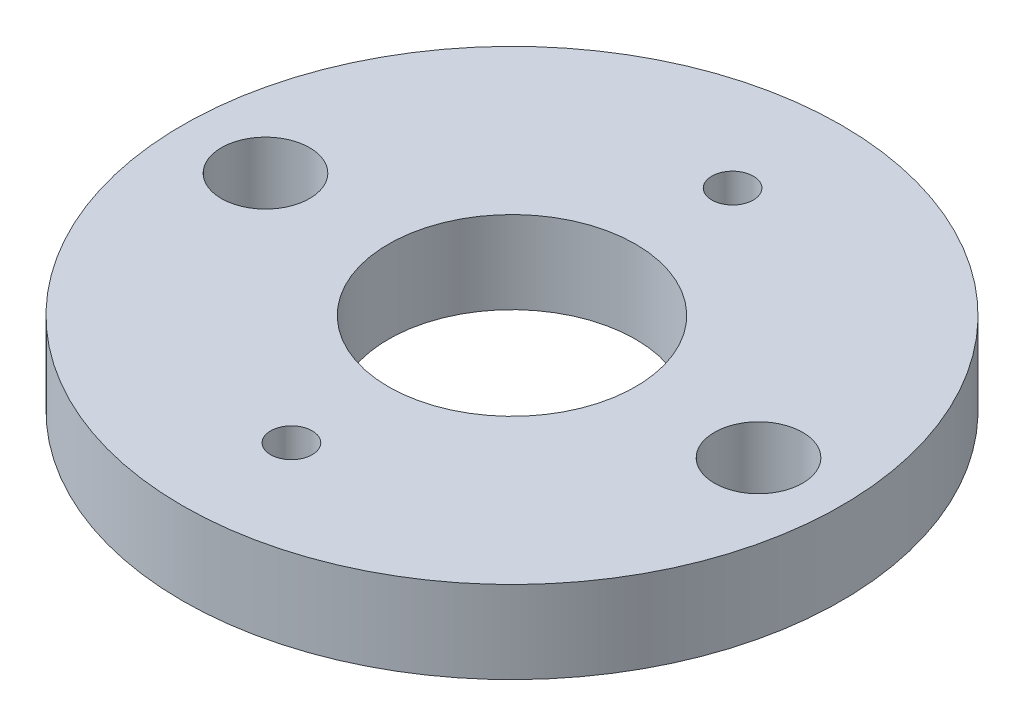
ISO-10303-21;
HEADER;
FILE_DESCRIPTION(('STEP AP214'),'2;1');
FILE_NAME('part.step','',(''),(''),'','','');
FILE_SCHEMA(('AUTOMOTIVE_DESIGN { 1 0 10303 214 1 1 1 1 }'));
ENDSEC;
DATA;
#1=APPLICATION_CONTEXT('core data for automotive mechanical design processes');
#2=APPLICATION_PROTOCOL_DEFINITION('international standard','automotive_design',2000,#1);
#3=PRODUCT_CONTEXT('',#1,'mechanical');
#4=PRODUCT('Part','Part','',(#3));
#5=PRODUCT_RELATED_PRODUCT_CATEGORY('part','',(#4));
#6=PRODUCT_DEFINITION_FORMATION('','',#4);
#7=PRODUCT_DEFINITION_CONTEXT('part definition',#1,'design');
#8=PRODUCT_DEFINITION('design','',#6,#7);
#9=PRODUCT_DEFINITION_SHAPE('','',#8);
#10=(LENGTH_UNIT() NAMED_UNIT(*) SI_UNIT(.MILLI.,.METRE.));
#11=(NAMED_UNIT(*) PLANE_ANGLE_UNIT() SI_UNIT($,.RADIAN.));
#12=(NAMED_UNIT(*) SI_UNIT($,.STERADIAN.) SOLID_ANGLE_UNIT());
#13=UNCERTAINTY_MEASURE_WITH_UNIT(LENGTH_MEASURE(1.E-05),#10,'distance_accuracy_value','');
#14=(GEOMETRIC_REPRESENTATION_CONTEXT(3) GLOBAL_UNCERTAINTY_ASSIGNED_CONTEXT((#13)) GLOBAL_UNIT_ASSIGNED_CONTEXT((#10,
#11,#12)) REPRESENTATION_CONTEXT('',''));
#15=CARTESIAN_POINT('',(0.,0.,0.));
#16=DIRECTION('',(0.,0.,1.));
#17=DIRECTION('',(1.,0.,0.));
#18=AXIS2_PLACEMENT_3D('',#15,#16,#17);
#19=CARTESIAN_POINT('',(0.,3.175,0.));
#20=DIRECTION('',(0.,1.,0.));
#21=DIRECTION('',(0.,0.,1.));
#22=AXIS2_PLACEMENT_3D('',#19,#20,#21);
#23=PLANE('',#22);
#24=CARTESIAN_POINT('',(0.,3.175,-8.5));
#25=DIRECTION('',(0.,1.,0.));
#26=DIRECTION('',(0.,0.,1.));
#27=AXIS2_PLACEMENT_3D('',#24,#25,#26);
#28=CIRCLE('',#27,0.799999999999999);
#29=CARTESIAN_POINT('',(0.,3.175,-7.7));
#30=VERTEX_POINT('',#29);
#31=EDGE_CURVE('E98',#30,#30,#28,.T.);
#32=ORIENTED_EDGE('',*,*,#31,.F.);
#33=EDGE_LOOP('',(#32));
#34=FACE_BOUND('',#33,.T.);
#35=CARTESIAN_POINT('',(0.,3.175,8.5));
#36=DIRECTION('',(0.,1.,0.));
#37=DIRECTION('',(0.,0.,1.));
#38=AXIS2_PLACEMENT_3D('',#35,#36,#37);
#39=CIRCLE('',#38,0.799999999999999);
#40=CARTESIAN_POINT('',(0.,3.175,9.3));
#41=VERTEX_POINT('',#40);
#42=EDGE_CURVE('E102',#41,#41,#39,.T.);
#43=ORIENTED_EDGE('',*,*,#42,.F.);
#44=EDGE_LOOP('',(#43));
#45=FACE_BOUND('',#44,.T.);
#46=CARTESIAN_POINT('',(-9.5,3.175,0.));
#47=DIRECTION('',(0.,1.,0.));
#48=DIRECTION('',(0.,0.,1.));
#49=AXIS2_PLACEMENT_3D('',#46,#47,#48);
#50=CIRCLE('',#49,1.69999999999999);
#51=CARTESIAN_POINT('',(-9.5,3.175,1.69999999999999));
#52=VERTEX_POINT('',#51);
#53=EDGE_CURVE('E106',#52,#52,#50,.T.);
#54=ORIENTED_EDGE('',*,*,#53,.F.);
#55=EDGE_LOOP('',(#54));
#56=FACE_BOUND('',#55,.T.);
#57=CARTESIAN_POINT('',(9.5,3.175,0.));
#58=DIRECTION('',(0.,1.,0.));
#59=DIRECTION('',(0.,0.,1.));
#60=AXIS2_PLACEMENT_3D('',#57,#58,#59);
#61=CIRCLE('',#60,1.69999999999999);
#62=CARTESIAN_POINT('',(9.5,3.175,1.69999999999999));
#63=VERTEX_POINT('',#62);
#64=EDGE_CURVE('E59',#63,#63,#61,.T.);
#65=ORIENTED_EDGE('',*,*,#64,.F.);
#66=EDGE_LOOP('',(#65));
#67=FACE_BOUND('',#66,.T.);
#68=CARTESIAN_POINT('',(0.,3.175,0.));
#69=DIRECTION('',(0.,1.,0.));
#70=DIRECTION('',(0.,0.,1.));
#71=AXIS2_PLACEMENT_3D('',#68,#69,#70);
#72=CIRCLE('',#71,12.7);
#73=CARTESIAN_POINT('',(0.,3.175,12.7));
#74=VERTEX_POINT('',#73);
#75=EDGE_CURVE('E11',#74,#74,#72,.T.);
#76=ORIENTED_EDGE('',*,*,#75,.T.);
#77=EDGE_LOOP('',(#76));
#78=FACE_BOUND('',#77,.T.);
#79=CARTESIAN_POINT('',(0.,3.175,0.));
#80=DIRECTION('',(0.,1.,0.));
#81=DIRECTION('',(0.,0.,1.));
#82=AXIS2_PLACEMENT_3D('',#79,#80,#81);
#83=CIRCLE('',#82,4.7625);
#84=CARTESIAN_POINT('',(0.,3.175,4.7625));
#85=VERTEX_POINT('',#84);
#86=EDGE_CURVE('E50',#85,#85,#83,.T.);
#87=ORIENTED_EDGE('',*,*,#86,.F.);
#88=EDGE_LOOP('',(#87));
#89=FACE_BOUND('',#88,.T.);
#90=ADVANCED_FACE('F36',(#34,#45,#56,#67,#78,#89),#23,.T.);
#91=CARTESIAN_POINT('',(0.,0.,0.));
#92=DIRECTION('',(0.,1.,0.));
#93=DIRECTION('',(0.,0.,1.));
#94=AXIS2_PLACEMENT_3D('',#91,#92,#93);
#95=PLANE('',#94);
#96=CARTESIAN_POINT('',(0.,0.,-8.5));
#97=DIRECTION('',(0.,1.,0.));
#98=DIRECTION('',(0.,0.,1.));
#99=AXIS2_PLACEMENT_3D('',#96,#97,#98);
#100=CIRCLE('',#99,0.799999999999999);
#101=CARTESIAN_POINT('',(0.,0.,-7.7));
#102=VERTEX_POINT('',#101);
#103=EDGE_CURVE('E126',#102,#102,#100,.T.);
#104=ORIENTED_EDGE('',*,*,#103,.T.);
#105=EDGE_LOOP('',(#104));
#106=FACE_BOUND('',#105,.T.);
#107=CARTESIAN_POINT('',(0.,0.,8.5));
#108=DIRECTION('',(0.,1.,0.));
#109=DIRECTION('',(0.,0.,1.));
#110=AXIS2_PLACEMENT_3D('',#107,#108,#109);
#111=CIRCLE('',#110,0.799999999999999);
#112=CARTESIAN_POINT('',(0.,0.,9.3));
#113=VERTEX_POINT('',#112);
#114=EDGE_CURVE('E117',#113,#113,#111,.T.);
#115=ORIENTED_EDGE('',*,*,#114,.T.);
#116=EDGE_LOOP('',(#115));
#117=FACE_BOUND('',#116,.T.);
#118=CARTESIAN_POINT('',(-9.5,0.,0.));
#119=DIRECTION('',(0.,1.,0.));
#120=DIRECTION('',(0.,0.,1.));
#121=AXIS2_PLACEMENT_3D('',#118,#119,#120);
#122=CIRCLE('',#121,1.69999999999999);
#123=CARTESIAN_POINT('',(-9.5,0.,1.69999999999999));
#124=VERTEX_POINT('',#123);
#125=EDGE_CURVE('E65',#124,#124,#122,.T.);
#126=ORIENTED_EDGE('',*,*,#125,.T.);
#127=EDGE_LOOP('',(#126));
#128=FACE_BOUND('',#127,.T.);
#129=CARTESIAN_POINT('',(9.5,0.,0.));
#130=DIRECTION('',(0.,1.,0.));
#131=DIRECTION('',(0.,0.,1.));
#132=AXIS2_PLACEMENT_3D('',#129,#130,#131);
#133=CIRCLE('',#132,1.69999999999999);
#134=CARTESIAN_POINT('',(9.5,0.,1.69999999999999));
#135=VERTEX_POINT('',#134);
#136=EDGE_CURVE('E64',#135,#135,#133,.T.);
#137=ORIENTED_EDGE('',*,*,#136,.T.);
#138=EDGE_LOOP('',(#137));
#139=FACE_BOUND('',#138,.T.);
#140=CARTESIAN_POINT('',(0.,0.,0.));
#141=DIRECTION('',(0.,1.,0.));
#142=DIRECTION('',(0.,0.,1.));
#143=AXIS2_PLACEMENT_3D('',#140,#141,#142);
#144=CIRCLE('',#143,12.7);
#145=CARTESIAN_POINT('',(0.,0.,12.7));
#146=VERTEX_POINT('',#145);
#147=EDGE_CURVE('E40',#146,#146,#144,.T.);
#148=ORIENTED_EDGE('',*,*,#147,.F.);
#149=EDGE_LOOP('',(#148));
#150=FACE_BOUND('',#149,.T.);
#151=CARTESIAN_POINT('',(0.,0.,0.));
#152=DIRECTION('',(0.,1.,0.));
#153=DIRECTION('',(0.,0.,1.));
#154=AXIS2_PLACEMENT_3D('',#151,#152,#153);
#155=CIRCLE('',#154,4.7625);
#156=CARTESIAN_POINT('',(0.,0.,4.7625));
#157=VERTEX_POINT('',#156);
#158=EDGE_CURVE('E53',#157,#157,#155,.T.);
#159=ORIENTED_EDGE('',*,*,#158,.T.);
#160=EDGE_LOOP('',(#159));
#161=FACE_BOUND('',#160,.T.);
#162=ADVANCED_FACE('F74',(#106,#117,#128,#139,#150,#161),#95,.F.);
#163=CARTESIAN_POINT('',(0.,3.175,0.));
#164=DIRECTION('',(0.,-1.,0.));
#165=DIRECTION('',(0.,0.,-1.));
#166=AXIS2_PLACEMENT_3D('',#163,#164,#165);
#167=CYLINDRICAL_SURFACE('',#166,12.7);
#168=ORIENTED_EDGE('',*,*,#75,.F.);
#169=EDGE_LOOP('',(#168));
#170=FACE_BOUND('',#169,.T.);
#171=ORIENTED_EDGE('',*,*,#147,.T.);
#172=EDGE_LOOP('',(#171));
#173=FACE_BOUND('',#172,.T.);
#174=ADVANCED_FACE('F38',(#170,#173),#167,.T.);
#175=CARTESIAN_POINT('',(0.,3.175,0.));
#176=DIRECTION('',(0.,-1.,0.));
#177=DIRECTION('',(0.,0.,-1.));
#178=AXIS2_PLACEMENT_3D('',#175,#176,#177);
#179=CYLINDRICAL_SURFACE('',#178,4.7625);
#180=ORIENTED_EDGE('',*,*,#86,.T.);
#181=EDGE_LOOP('',(#180));
#182=FACE_BOUND('',#181,.T.);
#183=ORIENTED_EDGE('',*,*,#158,.F.);
#184=EDGE_LOOP('',(#183));
#185=FACE_BOUND('',#184,.T.);
#186=ADVANCED_FACE('F76',(#182,#185),#179,.F.);
#187=CARTESIAN_POINT('',(9.5,3.175,0.));
#188=DIRECTION('',(0.,1.,0.));
#189=DIRECTION('',(0.,0.,1.));
#190=AXIS2_PLACEMENT_3D('',#187,#188,#189);
#191=CYLINDRICAL_SURFACE('',#190,1.69999999999999);
#192=ORIENTED_EDGE('',*,*,#64,.T.);
#193=EDGE_LOOP('',(#192));
#194=FACE_BOUND('',#193,.T.);
#195=ORIENTED_EDGE('',*,*,#136,.F.);
#196=EDGE_LOOP('',(#195));
#197=FACE_BOUND('',#196,.T.);
#198=ADVANCED_FACE('F78',(#194,#197),#191,.F.);
#199=CARTESIAN_POINT('',(-9.5,3.175,0.));
#200=DIRECTION('',(0.,1.,0.));
#201=DIRECTION('',(0.,0.,1.));
#202=AXIS2_PLACEMENT_3D('',#199,#200,#201);
#203=CYLINDRICAL_SURFACE('',#202,1.69999999999999);
#204=ORIENTED_EDGE('',*,*,#53,.T.);
#205=EDGE_LOOP('',(#204));
#206=FACE_BOUND('',#205,.T.);
#207=ORIENTED_EDGE('',*,*,#125,.F.);
#208=EDGE_LOOP('',(#207));
#209=FACE_BOUND('',#208,.T.);
#210=ADVANCED_FACE('F84',(#206,#209),#203,.F.);
#211=CARTESIAN_POINT('',(0.,3.175,8.5));
#212=DIRECTION('',(0.,1.,0.));
#213=DIRECTION('',(0.,0.,1.));
#214=AXIS2_PLACEMENT_3D('',#211,#212,#213);
#215=CYLINDRICAL_SURFACE('',#214,0.799999999999999);
#216=ORIENTED_EDGE('',*,*,#42,.T.);
#217=EDGE_LOOP('',(#216));
#218=FACE_BOUND('',#217,.T.);
#219=ORIENTED_EDGE('',*,*,#114,.F.);
#220=EDGE_LOOP('',(#219));
#221=FACE_BOUND('',#220,.T.);
#222=ADVANCED_FACE('F138',(#218,#221),#215,.F.);
#223=CARTESIAN_POINT('',(0.,3.175,-8.5));
#224=DIRECTION('',(0.,1.,0.));
#225=DIRECTION('',(0.,0.,1.));
#226=AXIS2_PLACEMENT_3D('',#223,#224,#225);
#227=CYLINDRICAL_SURFACE('',#226,0.799999999999999);
#228=ORIENTED_EDGE('',*,*,#31,.T.);
#229=EDGE_LOOP('',(#228));
#230=FACE_BOUND('',#229,.T.);
#231=ORIENTED_EDGE('',*,*,#103,.F.);
#232=EDGE_LOOP('',(#231));
#233=FACE_BOUND('',#232,.T.);
#234=ADVANCED_FACE('F136',(#230,#233),#227,.F.);
#235=CLOSED_SHELL('',(#90,#162,#174,#186,#198,#210,#222,#234));
#236=MANIFOLD_SOLID_BREP('B2',#235);
#237=ADVANCED_BREP_SHAPE_REPRESENTATION('',(#18,#236),#14);
#238=SHAPE_DEFINITION_REPRESENTATION(#9,#237);
ENDSEC;
END-ISO-10303-21;
